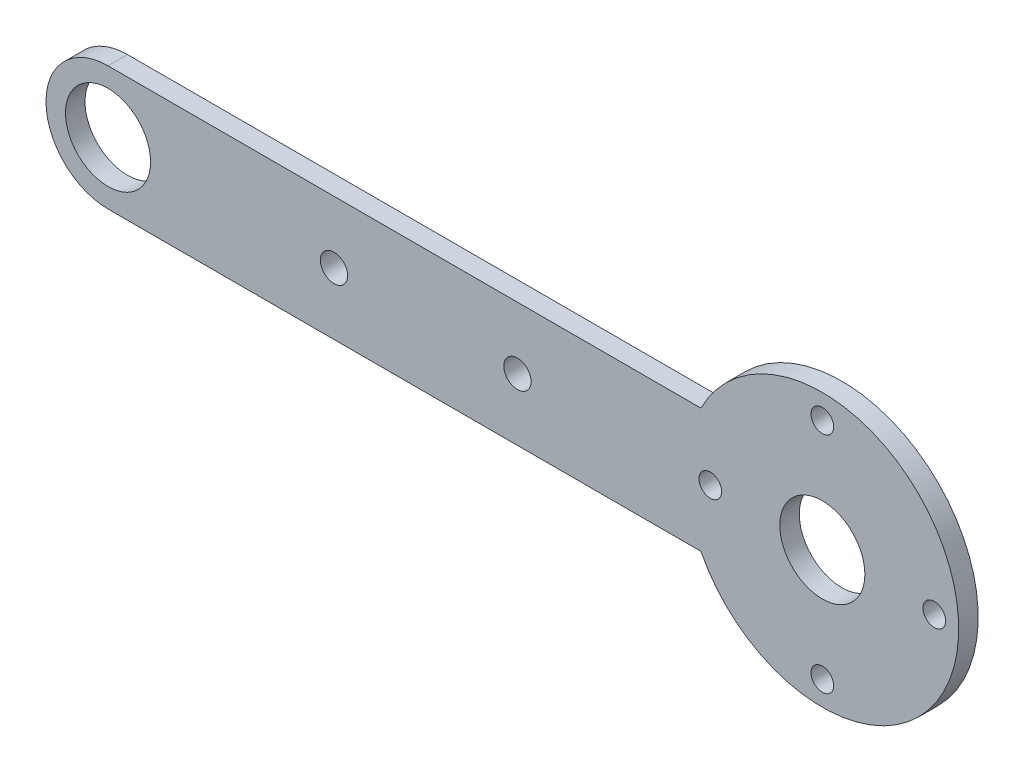
ISO-10303-21;
HEADER;
FILE_DESCRIPTION(('STEP AP214'),'2;1');
FILE_NAME('part.step','',(''),(''),'','','');
FILE_SCHEMA(('AUTOMOTIVE_DESIGN { 1 0 10303 214 1 1 1 1 }'));
ENDSEC;
DATA;
#1=APPLICATION_CONTEXT('core data for automotive mechanical design processes');
#2=APPLICATION_PROTOCOL_DEFINITION('international standard','automotive_design',2000,#1);
#3=PRODUCT_CONTEXT('',#1,'mechanical');
#4=PRODUCT('Part','Part','',(#3));
#5=PRODUCT_RELATED_PRODUCT_CATEGORY('part','',(#4));
#6=PRODUCT_DEFINITION_FORMATION('','',#4);
#7=PRODUCT_DEFINITION_CONTEXT('part definition',#1,'design');
#8=PRODUCT_DEFINITION('design','',#6,#7);
#9=PRODUCT_DEFINITION_SHAPE('','',#8);
#10=(LENGTH_UNIT() NAMED_UNIT(*) SI_UNIT(.MILLI.,.METRE.));
#11=(NAMED_UNIT(*) PLANE_ANGLE_UNIT() SI_UNIT($,.RADIAN.));
#12=(NAMED_UNIT(*) SI_UNIT($,.STERADIAN.) SOLID_ANGLE_UNIT());
#13=UNCERTAINTY_MEASURE_WITH_UNIT(LENGTH_MEASURE(1.E-05),#10,'distance_accuracy_value','');
#14=(GEOMETRIC_REPRESENTATION_CONTEXT(3) GLOBAL_UNCERTAINTY_ASSIGNED_CONTEXT((#13)) GLOBAL_UNIT_ASSIGNED_CONTEXT((#10,
#11,#12)) REPRESENTATION_CONTEXT('',''));
#15=CARTESIAN_POINT('',(0.,0.,0.));
#16=DIRECTION('',(0.,0.,1.));
#17=DIRECTION('',(1.,0.,0.));
#18=AXIS2_PLACEMENT_3D('',#15,#16,#17);
#19=CARTESIAN_POINT('',(-110.,0.,3.));
#20=DIRECTION('',(0.,0.,1.));
#21=DIRECTION('',(1.,0.,0.));
#22=AXIS2_PLACEMENT_3D('',#19,#20,#21);
#23=PLANE('',#22);
#24=CARTESIAN_POINT('',(17.25,0.,3.));
#25=DIRECTION('',(0.,0.,1.));
#26=DIRECTION('',(1.,0.,0.));
#27=AXIS2_PLACEMENT_3D('',#24,#25,#26);
#28=CIRCLE('',#27,1.75);
#29=CARTESIAN_POINT('',(19.,0.,3.));
#30=VERTEX_POINT('',#29);
#31=EDGE_CURVE('E146',#30,#30,#28,.T.);
#32=ORIENTED_EDGE('',*,*,#31,.F.);
#33=EDGE_LOOP('',(#32));
#34=FACE_BOUND('',#33,.T.);
#35=CARTESIAN_POINT('',(-17.25,0.,3.));
#36=DIRECTION('',(0.,0.,1.));
#37=DIRECTION('',(1.,0.,0.));
#38=AXIS2_PLACEMENT_3D('',#35,#36,#37);
#39=CIRCLE('',#38,1.75);
#40=CARTESIAN_POINT('',(-15.5,0.,3.));
#41=VERTEX_POINT('',#40);
#42=EDGE_CURVE('E134',#41,#41,#39,.T.);
#43=ORIENTED_EDGE('',*,*,#42,.F.);
#44=EDGE_LOOP('',(#43));
#45=FACE_BOUND('',#44,.T.);
#46=CARTESIAN_POINT('',(0.,0.,3.));
#47=DIRECTION('',(0.,0.,1.));
#48=DIRECTION('',(1.,0.,0.));
#49=AXIS2_PLACEMENT_3D('',#46,#47,#48);
#50=CIRCLE('',#49,6.55);
#51=CARTESIAN_POINT('',(6.55,0.,3.));
#52=VERTEX_POINT('',#51);
#53=EDGE_CURVE('E122',#52,#52,#50,.T.);
#54=ORIENTED_EDGE('',*,*,#53,.F.);
#55=EDGE_LOOP('',(#54));
#56=FACE_BOUND('',#55,.T.);
#57=CARTESIAN_POINT('',(-110.,0.,3.));
#58=DIRECTION('',(0.,0.,1.));
#59=DIRECTION('',(1.,0.,0.));
#60=AXIS2_PLACEMENT_3D('',#57,#58,#59);
#61=CIRCLE('',#60,6.55000000000001);
#62=CARTESIAN_POINT('',(-103.45,0.,3.));
#63=VERTEX_POINT('',#62);
#64=EDGE_CURVE('E101',#63,#63,#61,.T.);
#65=ORIENTED_EDGE('',*,*,#64,.F.);
#66=EDGE_LOOP('',(#65));
#67=FACE_BOUND('',#66,.T.);
#68=CARTESIAN_POINT('',(-110.,0.,3.));
#69=DIRECTION('',(0.,0.,1.));
#70=DIRECTION('',(1.,0.,0.));
#71=AXIS2_PLACEMENT_3D('',#68,#69,#70);
#72=CIRCLE('',#71,9.55);
#73=CARTESIAN_POINT('',(-110.,9.55,3.));
#74=VERTEX_POINT('',#73);
#75=CARTESIAN_POINT('',(-110.,-9.55,3.));
#76=VERTEX_POINT('',#75);
#77=EDGE_CURVE('E86',#74,#76,#72,.T.);
#78=ORIENTED_EDGE('',*,*,#77,.T.);
#79=DIRECTION('',(1.,0.,0.));
#80=VECTOR('',#79,1.);
#81=CARTESIAN_POINT('',(-110.,-9.55,3.));
#82=LINE('',#81,#80);
#83=CARTESIAN_POINT('',(-18.7028741106815,-9.54999999999998,3.));
#84=VERTEX_POINT('',#83);
#85=EDGE_CURVE('E81',#76,#84,#82,.T.);
#86=ORIENTED_EDGE('',*,*,#85,.T.);
#87=CARTESIAN_POINT('',(0.,0.,3.));
#88=DIRECTION('',(0.,0.,1.));
#89=DIRECTION('',(1.,0.,0.));
#90=AXIS2_PLACEMENT_3D('',#87,#88,#89);
#91=CIRCLE('',#90,21.);
#92=CARTESIAN_POINT('',(-18.7028741106815,9.54999999999999,3.));
#93=VERTEX_POINT('',#92);
#94=EDGE_CURVE('E84',#84,#93,#91,.T.);
#95=ORIENTED_EDGE('',*,*,#94,.T.);
#96=DIRECTION('',(-1.,0.,0.));
#97=VECTOR('',#96,1.);
#98=CARTESIAN_POINT('',(-110.,9.55,3.));
#99=LINE('',#98,#97);
#100=EDGE_CURVE('E51',#93,#74,#99,.T.);
#101=ORIENTED_EDGE('',*,*,#100,.T.);
#102=EDGE_LOOP('',(#78,#86,#95,#101));
#103=FACE_BOUND('',#102,.T.);
#104=CARTESIAN_POINT('',(-75.2009580368938,0.,3.));
#105=DIRECTION('',(0.,0.,1.));
#106=DIRECTION('',(1.,0.,0.));
#107=AXIS2_PLACEMENT_3D('',#104,#105,#106);
#108=CIRCLE('',#107,2.1);
#109=CARTESIAN_POINT('',(-73.1009580368938,0.,3.));
#110=VERTEX_POINT('',#109);
#111=EDGE_CURVE('E116',#110,#110,#108,.T.);
#112=ORIENTED_EDGE('',*,*,#111,.F.);
#113=EDGE_LOOP('',(#112));
#114=FACE_BOUND('',#113,.T.);
#115=CARTESIAN_POINT('',(-46.9519160737877,0.,3.));
#116=DIRECTION('',(0.,0.,1.));
#117=DIRECTION('',(1.,0.,0.));
#118=AXIS2_PLACEMENT_3D('',#115,#116,#117);
#119=CIRCLE('',#118,2.1);
#120=CARTESIAN_POINT('',(-44.8519160737877,0.,3.));
#121=VERTEX_POINT('',#120);
#122=EDGE_CURVE('E128',#121,#121,#119,.T.);
#123=ORIENTED_EDGE('',*,*,#122,.F.);
#124=EDGE_LOOP('',(#123));
#125=FACE_BOUND('',#124,.T.);
#126=CARTESIAN_POINT('',(0.,17.25,3.));
#127=DIRECTION('',(0.,0.,1.));
#128=DIRECTION('',(1.,0.,0.));
#129=AXIS2_PLACEMENT_3D('',#126,#127,#128);
#130=CIRCLE('',#129,1.75);
#131=CARTESIAN_POINT('',(1.75,17.25,3.));
#132=VERTEX_POINT('',#131);
#133=EDGE_CURVE('E140',#132,#132,#130,.T.);
#134=ORIENTED_EDGE('',*,*,#133,.F.);
#135=EDGE_LOOP('',(#134));
#136=FACE_BOUND('',#135,.T.);
#137=CARTESIAN_POINT('',(0.,-17.25,3.));
#138=DIRECTION('',(0.,0.,1.));
#139=DIRECTION('',(1.,0.,0.));
#140=AXIS2_PLACEMENT_3D('',#137,#138,#139);
#141=CIRCLE('',#140,1.75);
#142=CARTESIAN_POINT('',(1.75,-17.25,3.));
#143=VERTEX_POINT('',#142);
#144=EDGE_CURVE('E152',#143,#143,#141,.T.);
#145=ORIENTED_EDGE('',*,*,#144,.F.);
#146=EDGE_LOOP('',(#145));
#147=FACE_BOUND('',#146,.T.);
#148=ADVANCED_FACE('F34',(#34,#45,#56,#67,#103,#114,#125,#136,#147),#23,.T.);
#149=CARTESIAN_POINT('',(-110.,0.,0.));
#150=DIRECTION('',(0.,0.,1.));
#151=DIRECTION('',(1.,0.,0.));
#152=AXIS2_PLACEMENT_3D('',#149,#150,#151);
#153=PLANE('',#152);
#154=CARTESIAN_POINT('',(-110.,0.,0.));
#155=DIRECTION('',(0.,0.,1.));
#156=DIRECTION('',(1.,0.,0.));
#157=AXIS2_PLACEMENT_3D('',#154,#155,#156);
#158=CIRCLE('',#157,9.55);
#159=CARTESIAN_POINT('',(-110.,9.55,0.));
#160=VERTEX_POINT('',#159);
#161=CARTESIAN_POINT('',(-110.,-9.55,0.));
#162=VERTEX_POINT('',#161);
#163=EDGE_CURVE('E98',#160,#162,#158,.T.);
#164=ORIENTED_EDGE('',*,*,#163,.F.);
#165=DIRECTION('',(-1.,0.,0.));
#166=VECTOR('',#165,1.);
#167=CARTESIAN_POINT('',(-110.,9.55,0.));
#168=LINE('',#167,#166);
#169=CARTESIAN_POINT('',(-18.7028741106815,9.54999999999999,0.));
#170=VERTEX_POINT('',#169);
#171=EDGE_CURVE('E74',#170,#160,#168,.T.);
#172=ORIENTED_EDGE('',*,*,#171,.F.);
#173=CARTESIAN_POINT('',(0.,0.,0.));
#174=DIRECTION('',(0.,0.,1.));
#175=DIRECTION('',(1.,0.,0.));
#176=AXIS2_PLACEMENT_3D('',#173,#174,#175);
#177=CIRCLE('',#176,21.);
#178=CARTESIAN_POINT('',(-18.7028741106815,-9.54999999999998,0.));
#179=VERTEX_POINT('',#178);
#180=EDGE_CURVE('E68',#179,#170,#177,.T.);
#181=ORIENTED_EDGE('',*,*,#180,.F.);
#182=DIRECTION('',(1.,0.,0.));
#183=VECTOR('',#182,1.);
#184=CARTESIAN_POINT('',(-110.,-9.55,0.));
#185=LINE('',#184,#183);
#186=EDGE_CURVE('E90',#162,#179,#185,.T.);
#187=ORIENTED_EDGE('',*,*,#186,.F.);
#188=EDGE_LOOP('',(#164,#172,#181,#187));
#189=FACE_BOUND('',#188,.T.);
#190=CARTESIAN_POINT('',(-110.,0.,0.));
#191=DIRECTION('',(0.,0.,1.));
#192=DIRECTION('',(1.,0.,0.));
#193=AXIS2_PLACEMENT_3D('',#190,#191,#192);
#194=CIRCLE('',#193,6.55000000000001);
#195=CARTESIAN_POINT('',(-103.45,0.,0.));
#196=VERTEX_POINT('',#195);
#197=EDGE_CURVE('E113',#196,#196,#194,.T.);
#198=ORIENTED_EDGE('',*,*,#197,.T.);
#199=EDGE_LOOP('',(#198));
#200=FACE_BOUND('',#199,.T.);
#201=CARTESIAN_POINT('',(-75.2009580368938,0.,0.));
#202=DIRECTION('',(0.,0.,1.));
#203=DIRECTION('',(1.,0.,0.));
#204=AXIS2_PLACEMENT_3D('',#201,#202,#203);
#205=CIRCLE('',#204,2.1);
#206=CARTESIAN_POINT('',(-73.1009580368938,0.,0.));
#207=VERTEX_POINT('',#206);
#208=EDGE_CURVE('E119',#207,#207,#205,.T.);
#209=ORIENTED_EDGE('',*,*,#208,.T.);
#210=EDGE_LOOP('',(#209));
#211=FACE_BOUND('',#210,.T.);
#212=CARTESIAN_POINT('',(0.,0.,0.));
#213=DIRECTION('',(0.,0.,1.));
#214=DIRECTION('',(1.,0.,0.));
#215=AXIS2_PLACEMENT_3D('',#212,#213,#214);
#216=CIRCLE('',#215,6.55);
#217=CARTESIAN_POINT('',(6.55,0.,0.));
#218=VERTEX_POINT('',#217);
#219=EDGE_CURVE('E125',#218,#218,#216,.T.);
#220=ORIENTED_EDGE('',*,*,#219,.T.);
#221=EDGE_LOOP('',(#220));
#222=FACE_BOUND('',#221,.T.);
#223=CARTESIAN_POINT('',(-46.9519160737877,0.,0.));
#224=DIRECTION('',(0.,0.,1.));
#225=DIRECTION('',(1.,0.,0.));
#226=AXIS2_PLACEMENT_3D('',#223,#224,#225);
#227=CIRCLE('',#226,2.1);
#228=CARTESIAN_POINT('',(-44.8519160737877,0.,0.));
#229=VERTEX_POINT('',#228);
#230=EDGE_CURVE('E131',#229,#229,#227,.T.);
#231=ORIENTED_EDGE('',*,*,#230,.T.);
#232=EDGE_LOOP('',(#231));
#233=FACE_BOUND('',#232,.T.);
#234=CARTESIAN_POINT('',(-17.25,0.,0.));
#235=DIRECTION('',(0.,0.,1.));
#236=DIRECTION('',(1.,0.,0.));
#237=AXIS2_PLACEMENT_3D('',#234,#235,#236);
#238=CIRCLE('',#237,1.75);
#239=CARTESIAN_POINT('',(-15.5,0.,0.));
#240=VERTEX_POINT('',#239);
#241=EDGE_CURVE('E137',#240,#240,#238,.T.);
#242=ORIENTED_EDGE('',*,*,#241,.T.);
#243=EDGE_LOOP('',(#242));
#244=FACE_BOUND('',#243,.T.);
#245=CARTESIAN_POINT('',(0.,17.25,0.));
#246=DIRECTION('',(0.,0.,1.));
#247=DIRECTION('',(1.,0.,0.));
#248=AXIS2_PLACEMENT_3D('',#245,#246,#247);
#249=CIRCLE('',#248,1.75);
#250=CARTESIAN_POINT('',(1.75,17.25,0.));
#251=VERTEX_POINT('',#250);
#252=EDGE_CURVE('E143',#251,#251,#249,.T.);
#253=ORIENTED_EDGE('',*,*,#252,.T.);
#254=EDGE_LOOP('',(#253));
#255=FACE_BOUND('',#254,.T.);
#256=CARTESIAN_POINT('',(17.25,0.,0.));
#257=DIRECTION('',(0.,0.,1.));
#258=DIRECTION('',(1.,0.,0.));
#259=AXIS2_PLACEMENT_3D('',#256,#257,#258);
#260=CIRCLE('',#259,1.75);
#261=CARTESIAN_POINT('',(19.,0.,0.));
#262=VERTEX_POINT('',#261);
#263=EDGE_CURVE('E149',#262,#262,#260,.T.);
#264=ORIENTED_EDGE('',*,*,#263,.T.);
#265=EDGE_LOOP('',(#264));
#266=FACE_BOUND('',#265,.T.);
#267=CARTESIAN_POINT('',(0.,-17.25,0.));
#268=DIRECTION('',(0.,0.,1.));
#269=DIRECTION('',(1.,0.,0.));
#270=AXIS2_PLACEMENT_3D('',#267,#268,#269);
#271=CIRCLE('',#270,1.75);
#272=CARTESIAN_POINT('',(1.75,-17.25,0.));
#273=VERTEX_POINT('',#272);
#274=EDGE_CURVE('E155',#273,#273,#271,.T.);
#275=ORIENTED_EDGE('',*,*,#274,.T.);
#276=EDGE_LOOP('',(#275));
#277=FACE_BOUND('',#276,.T.);
#278=ADVANCED_FACE('F109',(#189,#200,#211,#222,#233,#244,#255,#266,#277),#153,.F.);
#279=CARTESIAN_POINT('',(-110.,0.,3.));
#280=DIRECTION('',(0.,0.,-1.));
#281=DIRECTION('',(-1.,0.,0.));
#282=AXIS2_PLACEMENT_3D('',#279,#280,#281);
#283=CYLINDRICAL_SURFACE('',#282,9.55);
#284=ORIENTED_EDGE('',*,*,#163,.T.);
#285=DIRECTION('',(0.,0.,-1.));
#286=VECTOR('',#285,1.);
#287=CARTESIAN_POINT('',(-110.,-9.55,3.));
#288=LINE('',#287,#286);
#289=EDGE_CURVE('E11',#76,#162,#288,.T.);
#290=ORIENTED_EDGE('',*,*,#289,.F.);
#291=ORIENTED_EDGE('',*,*,#77,.F.);
#292=DIRECTION('',(0.,0.,-1.));
#293=VECTOR('',#292,1.);
#294=CARTESIAN_POINT('',(-110.,9.55,3.));
#295=LINE('',#294,#293);
#296=EDGE_CURVE('E94',#74,#160,#295,.T.);
#297=ORIENTED_EDGE('',*,*,#296,.T.);
#298=EDGE_LOOP('',(#284,#290,#291,#297));
#299=FACE_BOUND('',#298,.T.);
#300=ADVANCED_FACE('F36',(#299),#283,.T.);
#301=CARTESIAN_POINT('',(-110.,-9.55,3.));
#302=DIRECTION('',(0.,1.,0.));
#303=DIRECTION('',(-1.,0.,0.));
#304=AXIS2_PLACEMENT_3D('',#301,#302,#303);
#305=PLANE('',#304);
#306=ORIENTED_EDGE('',*,*,#186,.T.);
#307=DIRECTION('',(0.,0.,-1.));
#308=VECTOR('',#307,1.);
#309=CARTESIAN_POINT('',(-18.7028741106815,-9.54999999999998,3.));
#310=LINE('',#309,#308);
#311=EDGE_CURVE('E43',#84,#179,#310,.T.);
#312=ORIENTED_EDGE('',*,*,#311,.F.);
#313=ORIENTED_EDGE('',*,*,#85,.F.);
#314=ORIENTED_EDGE('',*,*,#289,.T.);
#315=EDGE_LOOP('',(#306,#312,#313,#314));
#316=FACE_BOUND('',#315,.T.);
#317=ADVANCED_FACE('F89',(#316),#305,.F.);
#318=CARTESIAN_POINT('',(0.,0.,3.));
#319=DIRECTION('',(0.,0.,-1.));
#320=DIRECTION('',(-1.,0.,0.));
#321=AXIS2_PLACEMENT_3D('',#318,#319,#320);
#322=CYLINDRICAL_SURFACE('',#321,21.);
#323=ORIENTED_EDGE('',*,*,#180,.T.);
#324=DIRECTION('',(0.,0.,-1.));
#325=VECTOR('',#324,1.);
#326=CARTESIAN_POINT('',(-18.7028741106815,9.54999999999999,3.));
#327=LINE('',#326,#325);
#328=EDGE_CURVE('E91',#93,#170,#327,.T.);
#329=ORIENTED_EDGE('',*,*,#328,.F.);
#330=ORIENTED_EDGE('',*,*,#94,.F.);
#331=ORIENTED_EDGE('',*,*,#311,.T.);
#332=EDGE_LOOP('',(#323,#329,#330,#331));
#333=FACE_BOUND('',#332,.T.);
#334=ADVANCED_FACE('F92',(#333),#322,.T.);
#335=CARTESIAN_POINT('',(-110.,9.55,3.));
#336=DIRECTION('',(0.,-1.,0.));
#337=DIRECTION('',(1.,0.,0.));
#338=AXIS2_PLACEMENT_3D('',#335,#336,#337);
#339=PLANE('',#338);
#340=ORIENTED_EDGE('',*,*,#171,.T.);
#341=ORIENTED_EDGE('',*,*,#296,.F.);
#342=ORIENTED_EDGE('',*,*,#100,.F.);
#343=ORIENTED_EDGE('',*,*,#328,.T.);
#344=EDGE_LOOP('',(#340,#341,#342,#343));
#345=FACE_BOUND('',#344,.T.);
#346=ADVANCED_FACE('F106',(#345),#339,.F.);
#347=CARTESIAN_POINT('',(-110.,0.,3.));
#348=DIRECTION('',(0.,0.,-1.));
#349=DIRECTION('',(-1.,0.,0.));
#350=AXIS2_PLACEMENT_3D('',#347,#348,#349);
#351=CYLINDRICAL_SURFACE('',#350,6.55000000000001);
#352=ORIENTED_EDGE('',*,*,#64,.T.);
#353=EDGE_LOOP('',(#352));
#354=FACE_BOUND('',#353,.T.);
#355=ORIENTED_EDGE('',*,*,#197,.F.);
#356=EDGE_LOOP('',(#355));
#357=FACE_BOUND('',#356,.T.);
#358=ADVANCED_FACE('F174',(#354,#357),#351,.F.);
#359=CARTESIAN_POINT('',(-75.2009580368938,0.,3.));
#360=DIRECTION('',(0.,0.,-1.));
#361=DIRECTION('',(-1.,0.,0.));
#362=AXIS2_PLACEMENT_3D('',#359,#360,#361);
#363=CYLINDRICAL_SURFACE('',#362,2.1);
#364=ORIENTED_EDGE('',*,*,#111,.T.);
#365=EDGE_LOOP('',(#364));
#366=FACE_BOUND('',#365,.T.);
#367=ORIENTED_EDGE('',*,*,#208,.F.);
#368=EDGE_LOOP('',(#367));
#369=FACE_BOUND('',#368,.T.);
#370=ADVANCED_FACE('F220',(#366,#369),#363,.F.);
#371=CARTESIAN_POINT('',(0.,0.,3.));
#372=DIRECTION('',(0.,0.,-1.));
#373=DIRECTION('',(-1.,0.,0.));
#374=AXIS2_PLACEMENT_3D('',#371,#372,#373);
#375=CYLINDRICAL_SURFACE('',#374,6.55);
#376=ORIENTED_EDGE('',*,*,#53,.T.);
#377=EDGE_LOOP('',(#376));
#378=FACE_BOUND('',#377,.T.);
#379=ORIENTED_EDGE('',*,*,#219,.F.);
#380=EDGE_LOOP('',(#379));
#381=FACE_BOUND('',#380,.T.);
#382=ADVANCED_FACE('F228',(#378,#381),#375,.F.);
#383=CARTESIAN_POINT('',(-46.9519160737877,0.,3.));
#384=DIRECTION('',(0.,0.,-1.));
#385=DIRECTION('',(-1.,0.,0.));
#386=AXIS2_PLACEMENT_3D('',#383,#384,#385);
#387=CYLINDRICAL_SURFACE('',#386,2.1);
#388=ORIENTED_EDGE('',*,*,#122,.T.);
#389=EDGE_LOOP('',(#388));
#390=FACE_BOUND('',#389,.T.);
#391=ORIENTED_EDGE('',*,*,#230,.F.);
#392=EDGE_LOOP('',(#391));
#393=FACE_BOUND('',#392,.T.);
#394=ADVANCED_FACE('F236',(#390,#393),#387,.F.);
#395=CARTESIAN_POINT('',(-17.25,0.,3.));
#396=DIRECTION('',(0.,0.,-1.));
#397=DIRECTION('',(-1.,0.,0.));
#398=AXIS2_PLACEMENT_3D('',#395,#396,#397);
#399=CYLINDRICAL_SURFACE('',#398,1.75);
#400=ORIENTED_EDGE('',*,*,#42,.T.);
#401=EDGE_LOOP('',(#400));
#402=FACE_BOUND('',#401,.T.);
#403=ORIENTED_EDGE('',*,*,#241,.F.);
#404=EDGE_LOOP('',(#403));
#405=FACE_BOUND('',#404,.T.);
#406=ADVANCED_FACE('F245',(#402,#405),#399,.F.);
#407=CARTESIAN_POINT('',(0.,17.25,3.));
#408=DIRECTION('',(0.,0.,-1.));
#409=DIRECTION('',(-1.,0.,0.));
#410=AXIS2_PLACEMENT_3D('',#407,#408,#409);
#411=CYLINDRICAL_SURFACE('',#410,1.75);
#412=ORIENTED_EDGE('',*,*,#133,.T.);
#413=EDGE_LOOP('',(#412));
#414=FACE_BOUND('',#413,.T.);
#415=ORIENTED_EDGE('',*,*,#252,.F.);
#416=EDGE_LOOP('',(#415));
#417=FACE_BOUND('',#416,.T.);
#418=ADVANCED_FACE('F254',(#414,#417),#411,.F.);
#419=CARTESIAN_POINT('',(17.25,0.,3.));
#420=DIRECTION('',(0.,0.,-1.));
#421=DIRECTION('',(-1.,0.,0.));
#422=AXIS2_PLACEMENT_3D('',#419,#420,#421);
#423=CYLINDRICAL_SURFACE('',#422,1.75);
#424=ORIENTED_EDGE('',*,*,#31,.T.);
#425=EDGE_LOOP('',(#424));
#426=FACE_BOUND('',#425,.T.);
#427=ORIENTED_EDGE('',*,*,#263,.F.);
#428=EDGE_LOOP('',(#427));
#429=FACE_BOUND('',#428,.T.);
#430=ADVANCED_FACE('F263',(#426,#429),#423,.F.);
#431=CARTESIAN_POINT('',(0.,-17.25,3.));
#432=DIRECTION('',(0.,0.,-1.));
#433=DIRECTION('',(-1.,0.,0.));
#434=AXIS2_PLACEMENT_3D('',#431,#432,#433);
#435=CYLINDRICAL_SURFACE('',#434,1.75);
#436=ORIENTED_EDGE('',*,*,#144,.T.);
#437=EDGE_LOOP('',(#436));
#438=FACE_BOUND('',#437,.T.);
#439=ORIENTED_EDGE('',*,*,#274,.F.);
#440=EDGE_LOOP('',(#439));
#441=FACE_BOUND('',#440,.T.);
#442=ADVANCED_FACE('F161',(#438,#441),#435,.F.);
#443=CLOSED_SHELL('',(#148,#278,#300,#317,#334,#346,#358,#370,#382,#394,#406,#418,#430,#442));
#444=MANIFOLD_SOLID_BREP('B2',#443);
#445=ADVANCED_BREP_SHAPE_REPRESENTATION('',(#18,#444),#14);
#446=SHAPE_DEFINITION_REPRESENTATION(#9,#445);
ENDSEC;
END-ISO-10303-21;
